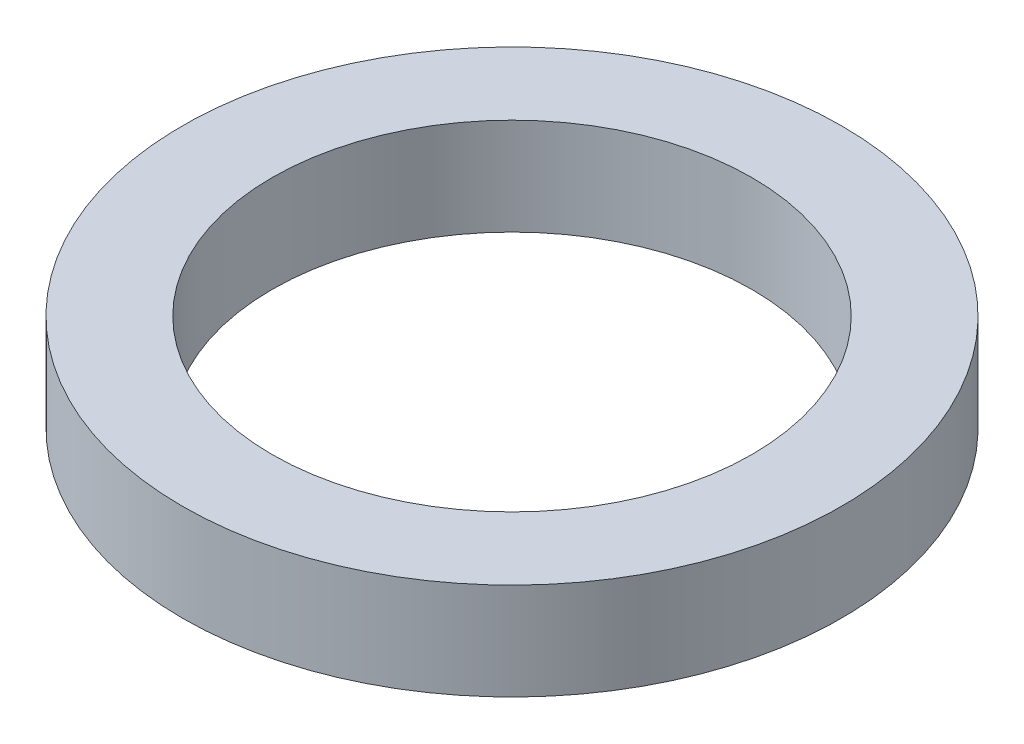
ISO-10303-21;
HEADER;
FILE_DESCRIPTION(('STEP AP214'),'2;1');
FILE_NAME('part.step','',(''),(''),'','','');
FILE_SCHEMA(('AUTOMOTIVE_DESIGN { 1 0 10303 214 1 1 1 1 }'));
ENDSEC;
DATA;
#1=APPLICATION_CONTEXT('core data for automotive mechanical design processes');
#2=APPLICATION_PROTOCOL_DEFINITION('international standard','automotive_design',2000,#1);
#3=PRODUCT_CONTEXT('',#1,'mechanical');
#4=PRODUCT('Part','Part','',(#3));
#5=PRODUCT_RELATED_PRODUCT_CATEGORY('part','',(#4));
#6=PRODUCT_DEFINITION_FORMATION('','',#4);
#7=PRODUCT_DEFINITION_CONTEXT('part definition',#1,'design');
#8=PRODUCT_DEFINITION('design','',#6,#7);
#9=PRODUCT_DEFINITION_SHAPE('','',#8);
#10=(LENGTH_UNIT() NAMED_UNIT(*) SI_UNIT(.MILLI.,.METRE.));
#11=(NAMED_UNIT(*) PLANE_ANGLE_UNIT() SI_UNIT($,.RADIAN.));
#12=(NAMED_UNIT(*) SI_UNIT($,.STERADIAN.) SOLID_ANGLE_UNIT());
#13=UNCERTAINTY_MEASURE_WITH_UNIT(LENGTH_MEASURE(1.E-05),#10,'distance_accuracy_value','');
#14=(GEOMETRIC_REPRESENTATION_CONTEXT(3) GLOBAL_UNCERTAINTY_ASSIGNED_CONTEXT((#13)) GLOBAL_UNIT_ASSIGNED_CONTEXT((#10,
#11,#12)) REPRESENTATION_CONTEXT('',''));
#15=CARTESIAN_POINT('',(0.,0.,0.));
#16=DIRECTION('',(0.,0.,1.));
#17=DIRECTION('',(1.,0.,0.));
#18=AXIS2_PLACEMENT_3D('',#15,#16,#17);
#19=CARTESIAN_POINT('',(0.,4.,0.));
#20=DIRECTION('',(0.,1.,0.));
#21=DIRECTION('',(0.,0.,1.));
#22=AXIS2_PLACEMENT_3D('',#19,#20,#21);
#23=PLANE('',#22);
#24=CARTESIAN_POINT('',(0.,4.,0.));
#25=DIRECTION('',(0.,1.,0.));
#26=DIRECTION('',(0.,0.,1.));
#27=AXIS2_PLACEMENT_3D('',#24,#25,#26);
#28=CIRCLE('',#27,13.6);
#29=CARTESIAN_POINT('',(0.,4.,13.6));
#30=VERTEX_POINT('',#29);
#31=EDGE_CURVE('E10',#30,#30,#28,.T.);
#32=ORIENTED_EDGE('',*,*,#31,.T.);
#33=EDGE_LOOP('',(#32));
#34=FACE_BOUND('',#33,.T.);
#35=CARTESIAN_POINT('',(0.,4.,0.));
#36=DIRECTION('',(0.,1.,0.));
#37=DIRECTION('',(0.,0.,1.));
#38=AXIS2_PLACEMENT_3D('',#35,#36,#37);
#39=CIRCLE('',#38,9.9);
#40=CARTESIAN_POINT('',(0.,4.,9.9));
#41=VERTEX_POINT('',#40);
#42=EDGE_CURVE('E56',#41,#41,#39,.T.);
#43=ORIENTED_EDGE('',*,*,#42,.F.);
#44=EDGE_LOOP('',(#43));
#45=FACE_BOUND('',#44,.T.);
#46=ADVANCED_FACE('F43',(#34,#45),#23,.T.);
#47=CARTESIAN_POINT('',(0.,0.,0.));
#48=DIRECTION('',(0.,1.,0.));
#49=DIRECTION('',(0.,0.,1.));
#50=AXIS2_PLACEMENT_3D('',#47,#48,#49);
#51=PLANE('',#50);
#52=CARTESIAN_POINT('',(0.,0.,0.));
#53=DIRECTION('',(0.,1.,0.));
#54=DIRECTION('',(0.,0.,1.));
#55=AXIS2_PLACEMENT_3D('',#52,#53,#54);
#56=CIRCLE('',#55,13.6);
#57=CARTESIAN_POINT('',(0.,0.,13.6));
#58=VERTEX_POINT('',#57);
#59=EDGE_CURVE('E47',#58,#58,#56,.T.);
#60=ORIENTED_EDGE('',*,*,#59,.F.);
#61=EDGE_LOOP('',(#60));
#62=FACE_BOUND('',#61,.T.);
#63=CARTESIAN_POINT('',(0.,0.,0.));
#64=DIRECTION('',(0.,1.,0.));
#65=DIRECTION('',(0.,0.,1.));
#66=AXIS2_PLACEMENT_3D('',#63,#64,#65);
#67=CIRCLE('',#66,9.9);
#68=CARTESIAN_POINT('',(0.,0.,9.9));
#69=VERTEX_POINT('',#68);
#70=EDGE_CURVE('E58',#69,#69,#67,.T.);
#71=ORIENTED_EDGE('',*,*,#70,.T.);
#72=EDGE_LOOP('',(#71));
#73=FACE_BOUND('',#72,.T.);
#74=ADVANCED_FACE('F70',(#62,#73),#51,.F.);
#75=CARTESIAN_POINT('',(0.,4.,0.));
#76=DIRECTION('',(0.,-1.,0.));
#77=DIRECTION('',(0.,0.,-1.));
#78=AXIS2_PLACEMENT_3D('',#75,#76,#77);
#79=CYLINDRICAL_SURFACE('',#78,13.6);
#80=ORIENTED_EDGE('',*,*,#31,.F.);
#81=EDGE_LOOP('',(#80));
#82=FACE_BOUND('',#81,.T.);
#83=ORIENTED_EDGE('',*,*,#59,.T.);
#84=EDGE_LOOP('',(#83));
#85=FACE_BOUND('',#84,.T.);
#86=ADVANCED_FACE('F45',(#82,#85),#79,.T.);
#87=CARTESIAN_POINT('',(0.,4.,0.));
#88=DIRECTION('',(0.,-1.,0.));
#89=DIRECTION('',(0.,0.,-1.));
#90=AXIS2_PLACEMENT_3D('',#87,#88,#89);
#91=CYLINDRICAL_SURFACE('',#90,9.9);
#92=ORIENTED_EDGE('',*,*,#42,.T.);
#93=EDGE_LOOP('',(#92));
#94=FACE_BOUND('',#93,.T.);
#95=ORIENTED_EDGE('',*,*,#70,.F.);
#96=EDGE_LOOP('',(#95));
#97=FACE_BOUND('',#96,.T.);
#98=ADVANCED_FACE('F66',(#94,#97),#91,.F.);
#99=CLOSED_SHELL('',(#46,#74,#86,#98));
#100=MANIFOLD_SOLID_BREP('B2',#99);
#101=ADVANCED_BREP_SHAPE_REPRESENTATION('',(#18,#100),#14);
#102=SHAPE_DEFINITION_REPRESENTATION(#9,#101);
ENDSEC;
END-ISO-10303-21;
